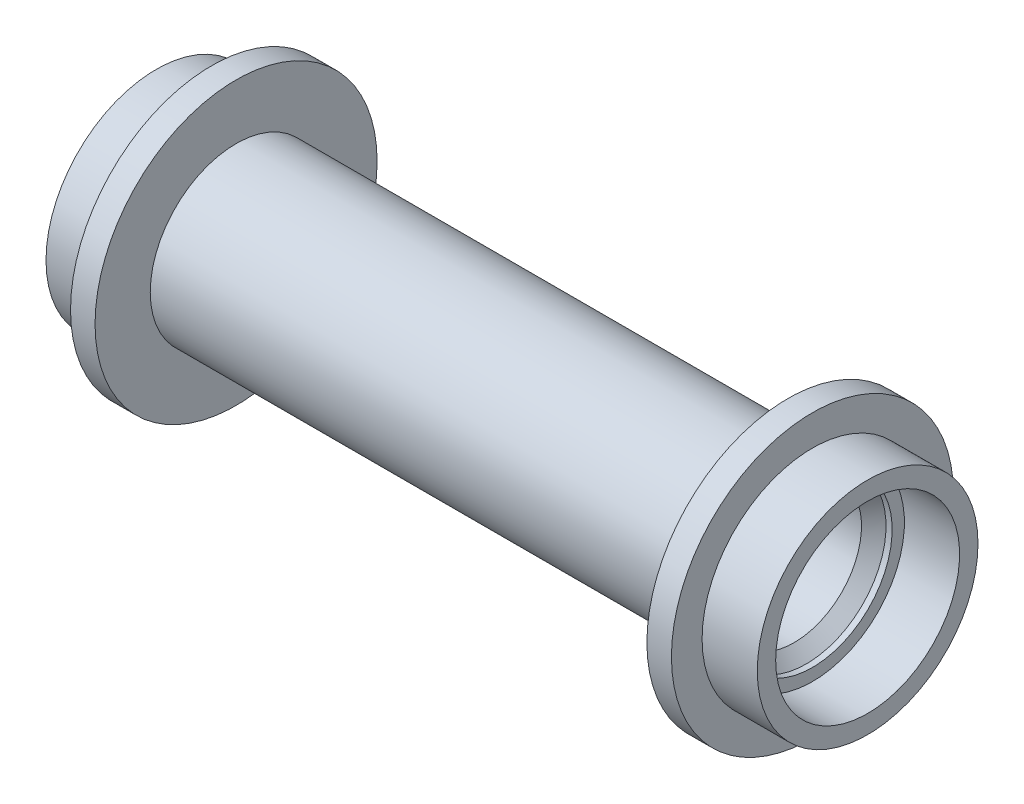
ISO-10303-21;
HEADER;
FILE_DESCRIPTION(('STEP AP214'),'2;1');
FILE_NAME('part.step','',(''),(''),'','','');
FILE_SCHEMA(('AUTOMOTIVE_DESIGN { 1 0 10303 214 1 1 1 1 }'));
ENDSEC;
DATA;
#1=APPLICATION_CONTEXT('core data for automotive mechanical design processes');
#2=APPLICATION_PROTOCOL_DEFINITION('international standard','automotive_design',2000,#1);
#3=PRODUCT_CONTEXT('',#1,'mechanical');
#4=PRODUCT('Part','Part','',(#3));
#5=PRODUCT_RELATED_PRODUCT_CATEGORY('part','',(#4));
#6=PRODUCT_DEFINITION_FORMATION('','',#4);
#7=PRODUCT_DEFINITION_CONTEXT('part definition',#1,'design');
#8=PRODUCT_DEFINITION('design','',#6,#7);
#9=PRODUCT_DEFINITION_SHAPE('','',#8);
#10=(LENGTH_UNIT() NAMED_UNIT(*) SI_UNIT(.MILLI.,.METRE.));
#11=(NAMED_UNIT(*) PLANE_ANGLE_UNIT() SI_UNIT($,.RADIAN.));
#12=(NAMED_UNIT(*) SI_UNIT($,.STERADIAN.) SOLID_ANGLE_UNIT());
#13=UNCERTAINTY_MEASURE_WITH_UNIT(LENGTH_MEASURE(1.E-05),#10,'distance_accuracy_value','');
#14=(GEOMETRIC_REPRESENTATION_CONTEXT(3) GLOBAL_UNCERTAINTY_ASSIGNED_CONTEXT((#13)) GLOBAL_UNIT_ASSIGNED_CONTEXT((#10,
#11,#12)) REPRESENTATION_CONTEXT('',''));
#15=CARTESIAN_POINT('',(0.,0.,0.));
#16=DIRECTION('',(0.,0.,1.));
#17=DIRECTION('',(1.,0.,0.));
#18=AXIS2_PLACEMENT_3D('',#15,#16,#17);
#19=CARTESIAN_POINT('',(0.,0.,0.));
#20=DIRECTION('',(-1.,0.,0.));
#21=DIRECTION('',(0.,0.,1.));
#22=AXIS2_PLACEMENT_3D('',#19,#20,#21);
#23=CYLINDRICAL_SURFACE('',#22,7.);
#24=CARTESIAN_POINT('',(22.5,0.,0.));
#25=DIRECTION('',(-1.,0.,0.));
#26=DIRECTION('',(0.,0.,1.));
#27=AXIS2_PLACEMENT_3D('',#24,#25,#26);
#28=CIRCLE('',#27,7.);
#29=CARTESIAN_POINT('',(22.5,0.,7.));
#30=VERTEX_POINT('',#29);
#31=EDGE_CURVE('E10',#30,#30,#28,.T.);
#32=ORIENTED_EDGE('',*,*,#31,.T.);
#33=EDGE_LOOP('',(#32));
#34=FACE_BOUND('',#33,.T.);
#35=CARTESIAN_POINT('',(-22.5,0.,0.));
#36=DIRECTION('',(-1.,0.,0.));
#37=DIRECTION('',(0.,0.,1.));
#38=AXIS2_PLACEMENT_3D('',#35,#36,#37);
#39=CIRCLE('',#38,7.);
#40=CARTESIAN_POINT('',(-22.5,0.,7.));
#41=VERTEX_POINT('',#40);
#42=EDGE_CURVE('E69',#41,#41,#39,.T.);
#43=ORIENTED_EDGE('',*,*,#42,.F.);
#44=EDGE_LOOP('',(#43));
#45=FACE_BOUND('',#44,.T.);
#46=ADVANCED_FACE('F32',(#34,#45),#23,.T.);
#47=CARTESIAN_POINT('',(22.5,0.,-7.));
#48=DIRECTION('',(1.,0.,0.));
#49=DIRECTION('',(0.,0.,-1.));
#50=AXIS2_PLACEMENT_3D('',#47,#48,#49);
#51=PLANE('',#50);
#52=ORIENTED_EDGE('',*,*,#31,.F.);
#53=EDGE_LOOP('',(#52));
#54=FACE_BOUND('',#53,.T.);
#55=CARTESIAN_POINT('',(22.5,0.,0.));
#56=DIRECTION('',(-1.,0.,0.));
#57=DIRECTION('',(0.,0.,1.));
#58=AXIS2_PLACEMENT_3D('',#55,#56,#57);
#59=CIRCLE('',#58,11.5);
#60=CARTESIAN_POINT('',(22.5,0.,11.5));
#61=VERTEX_POINT('',#60);
#62=EDGE_CURVE('E38',#61,#61,#59,.T.);
#63=ORIENTED_EDGE('',*,*,#62,.T.);
#64=EDGE_LOOP('',(#63));
#65=FACE_BOUND('',#64,.T.);
#66=ADVANCED_FACE('F114',(#54,#65),#51,.F.);
#67=CARTESIAN_POINT('',(0.,0.,0.));
#68=DIRECTION('',(-1.,0.,0.));
#69=DIRECTION('',(0.,0.,1.));
#70=AXIS2_PLACEMENT_3D('',#67,#68,#69);
#71=CYLINDRICAL_SURFACE('',#70,11.5);
#72=ORIENTED_EDGE('',*,*,#62,.F.);
#73=EDGE_LOOP('',(#72));
#74=FACE_BOUND('',#73,.T.);
#75=CARTESIAN_POINT('',(24.5,0.,0.));
#76=DIRECTION('',(-1.,0.,0.));
#77=DIRECTION('',(0.,0.,1.));
#78=AXIS2_PLACEMENT_3D('',#75,#76,#77);
#79=CIRCLE('',#78,11.5);
#80=CARTESIAN_POINT('',(24.5,0.,11.5));
#81=VERTEX_POINT('',#80);
#82=EDGE_CURVE('E42',#81,#81,#79,.T.);
#83=ORIENTED_EDGE('',*,*,#82,.T.);
#84=EDGE_LOOP('',(#83));
#85=FACE_BOUND('',#84,.T.);
#86=ADVANCED_FACE('F118',(#74,#85),#71,.T.);
#87=CARTESIAN_POINT('',(24.5,0.,-11.5));
#88=DIRECTION('',(-1.,0.,0.));
#89=DIRECTION('',(0.,0.,1.));
#90=AXIS2_PLACEMENT_3D('',#87,#88,#89);
#91=PLANE('',#90);
#92=ORIENTED_EDGE('',*,*,#82,.F.);
#93=EDGE_LOOP('',(#92));
#94=FACE_BOUND('',#93,.T.);
#95=CARTESIAN_POINT('',(24.5,0.,0.));
#96=DIRECTION('',(-1.,0.,0.));
#97=DIRECTION('',(0.,0.,1.));
#98=AXIS2_PLACEMENT_3D('',#95,#96,#97);
#99=CIRCLE('',#98,9.);
#100=CARTESIAN_POINT('',(24.5,0.,9.));
#101=VERTEX_POINT('',#100);
#102=EDGE_CURVE('E46',#101,#101,#99,.T.);
#103=ORIENTED_EDGE('',*,*,#102,.T.);
#104=EDGE_LOOP('',(#103));
#105=FACE_BOUND('',#104,.T.);
#106=ADVANCED_FACE('F194',(#94,#105),#91,.F.);
#107=CARTESIAN_POINT('',(0.,0.,0.));
#108=DIRECTION('',(-1.,0.,0.));
#109=DIRECTION('',(0.,0.,1.));
#110=AXIS2_PLACEMENT_3D('',#107,#108,#109);
#111=CYLINDRICAL_SURFACE('',#110,9.);
#112=ORIENTED_EDGE('',*,*,#102,.F.);
#113=EDGE_LOOP('',(#112));
#114=FACE_BOUND('',#113,.T.);
#115=CARTESIAN_POINT('',(29.,0.,0.));
#116=DIRECTION('',(-1.,0.,0.));
#117=DIRECTION('',(0.,0.,1.));
#118=AXIS2_PLACEMENT_3D('',#115,#116,#117);
#119=CIRCLE('',#118,9.);
#120=CARTESIAN_POINT('',(29.,0.,9.));
#121=VERTEX_POINT('',#120);
#122=EDGE_CURVE('E51',#121,#121,#119,.T.);
#123=ORIENTED_EDGE('',*,*,#122,.T.);
#124=EDGE_LOOP('',(#123));
#125=FACE_BOUND('',#124,.T.);
#126=ADVANCED_FACE('F190',(#114,#125),#111,.T.);
#127=CARTESIAN_POINT('',(29.,0.,-9.));
#128=DIRECTION('',(-1.,0.,0.));
#129=DIRECTION('',(0.,0.,1.));
#130=AXIS2_PLACEMENT_3D('',#127,#128,#129);
#131=PLANE('',#130);
#132=ORIENTED_EDGE('',*,*,#122,.F.);
#133=EDGE_LOOP('',(#132));
#134=FACE_BOUND('',#133,.T.);
#135=CARTESIAN_POINT('',(29.,0.,0.));
#136=DIRECTION('',(-1.,0.,0.));
#137=DIRECTION('',(0.,0.,1.));
#138=AXIS2_PLACEMENT_3D('',#135,#136,#137);
#139=CIRCLE('',#138,7.5);
#140=CARTESIAN_POINT('',(29.,0.,7.5));
#141=VERTEX_POINT('',#140);
#142=EDGE_CURVE('E54',#141,#141,#139,.T.);
#143=ORIENTED_EDGE('',*,*,#142,.T.);
#144=EDGE_LOOP('',(#143));
#145=FACE_BOUND('',#144,.T.);
#146=ADVANCED_FACE('F186',(#134,#145),#131,.F.);
#147=CARTESIAN_POINT('',(0.,0.,0.));
#148=DIRECTION('',(-1.,0.,0.));
#149=DIRECTION('',(0.,0.,1.));
#150=AXIS2_PLACEMENT_3D('',#147,#148,#149);
#151=CYLINDRICAL_SURFACE('',#150,7.5);
#152=ORIENTED_EDGE('',*,*,#142,.F.);
#153=EDGE_LOOP('',(#152));
#154=FACE_BOUND('',#153,.T.);
#155=CARTESIAN_POINT('',(24.5,0.,0.));
#156=DIRECTION('',(-1.,0.,0.));
#157=DIRECTION('',(0.,0.,1.));
#158=AXIS2_PLACEMENT_3D('',#155,#156,#157);
#159=CIRCLE('',#158,7.5);
#160=CARTESIAN_POINT('',(24.5,0.,7.5));
#161=VERTEX_POINT('',#160);
#162=EDGE_CURVE('E57',#161,#161,#159,.T.);
#163=ORIENTED_EDGE('',*,*,#162,.T.);
#164=EDGE_LOOP('',(#163));
#165=FACE_BOUND('',#164,.T.);
#166=ADVANCED_FACE('F182',(#154,#165),#151,.F.);
#167=CARTESIAN_POINT('',(24.5,0.,-7.5));
#168=DIRECTION('',(-1.,0.,0.));
#169=DIRECTION('',(0.,0.,1.));
#170=AXIS2_PLACEMENT_3D('',#167,#168,#169);
#171=PLANE('',#170);
#172=ORIENTED_EDGE('',*,*,#162,.F.);
#173=EDGE_LOOP('',(#172));
#174=FACE_BOUND('',#173,.T.);
#175=CARTESIAN_POINT('',(24.5,0.,0.));
#176=DIRECTION('',(-1.,0.,0.));
#177=DIRECTION('',(0.,0.,1.));
#178=AXIS2_PLACEMENT_3D('',#175,#176,#177);
#179=CIRCLE('',#178,6.5);
#180=CARTESIAN_POINT('',(24.5,0.,6.5));
#181=VERTEX_POINT('',#180);
#182=EDGE_CURVE('E60',#181,#181,#179,.T.);
#183=ORIENTED_EDGE('',*,*,#182,.T.);
#184=EDGE_LOOP('',(#183));
#185=FACE_BOUND('',#184,.T.);
#186=ADVANCED_FACE('F178',(#174,#185),#171,.F.);
#187=CARTESIAN_POINT('',(0.,0.,0.));
#188=DIRECTION('',(-1.,0.,0.));
#189=DIRECTION('',(0.,0.,1.));
#190=AXIS2_PLACEMENT_3D('',#187,#188,#189);
#191=CYLINDRICAL_SURFACE('',#190,6.5);
#192=ORIENTED_EDGE('',*,*,#182,.F.);
#193=EDGE_LOOP('',(#192));
#194=FACE_BOUND('',#193,.T.);
#195=CARTESIAN_POINT('',(24.,0.,0.));
#196=DIRECTION('',(-1.,0.,0.));
#197=DIRECTION('',(0.,0.,1.));
#198=AXIS2_PLACEMENT_3D('',#195,#196,#197);
#199=CIRCLE('',#198,6.5);
#200=CARTESIAN_POINT('',(24.,0.,6.5));
#201=VERTEX_POINT('',#200);
#202=EDGE_CURVE('E63',#201,#201,#199,.T.);
#203=ORIENTED_EDGE('',*,*,#202,.T.);
#204=EDGE_LOOP('',(#203));
#205=FACE_BOUND('',#204,.T.);
#206=ADVANCED_FACE('F174',(#194,#205),#191,.F.);
#207=CARTESIAN_POINT('',(23.,0.,0.));
#208=DIRECTION('',(1.,0.,0.));
#209=DIRECTION('',(0.,0.,-1.));
#210=AXIS2_PLACEMENT_3D('',#207,#208,#209);
#211=CONICAL_SURFACE('',#210,5.5,0.785398163397451);
#212=ORIENTED_EDGE('',*,*,#202,.F.);
#213=EDGE_LOOP('',(#212));
#214=FACE_BOUND('',#213,.T.);
#215=CARTESIAN_POINT('',(23.,0.,0.));
#216=DIRECTION('',(-1.,0.,0.));
#217=DIRECTION('',(0.,0.,1.));
#218=AXIS2_PLACEMENT_3D('',#215,#216,#217);
#219=CIRCLE('',#218,5.5);
#220=CARTESIAN_POINT('',(23.,0.,5.5));
#221=VERTEX_POINT('',#220);
#222=EDGE_CURVE('E66',#221,#221,#219,.T.);
#223=ORIENTED_EDGE('',*,*,#222,.T.);
#224=EDGE_LOOP('',(#223));
#225=FACE_BOUND('',#224,.T.);
#226=ADVANCED_FACE('F170',(#214,#225),#211,.F.);
#227=CARTESIAN_POINT('',(0.,0.,0.));
#228=DIRECTION('',(-1.,0.,0.));
#229=DIRECTION('',(0.,0.,1.));
#230=AXIS2_PLACEMENT_3D('',#227,#228,#229);
#231=CYLINDRICAL_SURFACE('',#230,5.49999999999999);
#232=ORIENTED_EDGE('',*,*,#222,.F.);
#233=EDGE_LOOP('',(#232));
#234=FACE_BOUND('',#233,.T.);
#235=CARTESIAN_POINT('',(-23.,0.,0.));
#236=DIRECTION('',(-1.,0.,0.));
#237=DIRECTION('',(0.,0.,1.));
#238=AXIS2_PLACEMENT_3D('',#235,#236,#237);
#239=CIRCLE('',#238,5.5);
#240=CARTESIAN_POINT('',(-23.,0.,5.5));
#241=VERTEX_POINT('',#240);
#242=EDGE_CURVE('E96',#241,#241,#239,.T.);
#243=ORIENTED_EDGE('',*,*,#242,.T.);
#244=EDGE_LOOP('',(#243));
#245=FACE_BOUND('',#244,.T.);
#246=ADVANCED_FACE('F100',(#234,#245),#231,.F.);
#247=CARTESIAN_POINT('',(-22.5,0.,-7.));
#248=DIRECTION('',(-1.,0.,0.));
#249=DIRECTION('',(0.,0.,-1.));
#250=AXIS2_PLACEMENT_3D('',#247,#248,#249);
#251=PLANE('',#250);
#252=ORIENTED_EDGE('',*,*,#42,.T.);
#253=EDGE_LOOP('',(#252));
#254=FACE_BOUND('',#253,.T.);
#255=CARTESIAN_POINT('',(-22.5,0.,0.));
#256=DIRECTION('',(-1.,0.,0.));
#257=DIRECTION('',(0.,0.,1.));
#258=AXIS2_PLACEMENT_3D('',#255,#256,#257);
#259=CIRCLE('',#258,11.5);
#260=CARTESIAN_POINT('',(-22.5,0.,11.5));
#261=VERTEX_POINT('',#260);
#262=EDGE_CURVE('E72',#261,#261,#259,.T.);
#263=ORIENTED_EDGE('',*,*,#262,.F.);
#264=EDGE_LOOP('',(#263));
#265=FACE_BOUND('',#264,.T.);
#266=ADVANCED_FACE('F123',(#254,#265),#251,.F.);
#267=CARTESIAN_POINT('',(0.,0.,0.));
#268=DIRECTION('',(1.,0.,0.));
#269=DIRECTION('',(0.,0.,1.));
#270=AXIS2_PLACEMENT_3D('',#267,#268,#269);
#271=CYLINDRICAL_SURFACE('',#270,11.5);
#272=ORIENTED_EDGE('',*,*,#262,.T.);
#273=EDGE_LOOP('',(#272));
#274=FACE_BOUND('',#273,.T.);
#275=CARTESIAN_POINT('',(-24.5,0.,0.));
#276=DIRECTION('',(-1.,0.,0.));
#277=DIRECTION('',(0.,0.,1.));
#278=AXIS2_PLACEMENT_3D('',#275,#276,#277);
#279=CIRCLE('',#278,11.5);
#280=CARTESIAN_POINT('',(-24.5,0.,11.5));
#281=VERTEX_POINT('',#280);
#282=EDGE_CURVE('E75',#281,#281,#279,.T.);
#283=ORIENTED_EDGE('',*,*,#282,.F.);
#284=EDGE_LOOP('',(#283));
#285=FACE_BOUND('',#284,.T.);
#286=ADVANCED_FACE('F126',(#274,#285),#271,.T.);
#287=CARTESIAN_POINT('',(-24.5,0.,-11.5));
#288=DIRECTION('',(1.,0.,0.));
#289=DIRECTION('',(0.,0.,1.));
#290=AXIS2_PLACEMENT_3D('',#287,#288,#289);
#291=PLANE('',#290);
#292=ORIENTED_EDGE('',*,*,#282,.T.);
#293=EDGE_LOOP('',(#292));
#294=FACE_BOUND('',#293,.T.);
#295=CARTESIAN_POINT('',(-24.5,0.,0.));
#296=DIRECTION('',(-1.,0.,0.));
#297=DIRECTION('',(0.,0.,1.));
#298=AXIS2_PLACEMENT_3D('',#295,#296,#297);
#299=CIRCLE('',#298,9.);
#300=CARTESIAN_POINT('',(-24.5,0.,9.));
#301=VERTEX_POINT('',#300);
#302=EDGE_CURVE('E78',#301,#301,#299,.T.);
#303=ORIENTED_EDGE('',*,*,#302,.F.);
#304=EDGE_LOOP('',(#303));
#305=FACE_BOUND('',#304,.T.);
#306=ADVANCED_FACE('F132',(#294,#305),#291,.F.);
#307=CARTESIAN_POINT('',(0.,0.,0.));
#308=DIRECTION('',(1.,0.,0.));
#309=DIRECTION('',(0.,0.,1.));
#310=AXIS2_PLACEMENT_3D('',#307,#308,#309);
#311=CYLINDRICAL_SURFACE('',#310,9.);
#312=ORIENTED_EDGE('',*,*,#302,.T.);
#313=EDGE_LOOP('',(#312));
#314=FACE_BOUND('',#313,.T.);
#315=CARTESIAN_POINT('',(-29.,0.,0.));
#316=DIRECTION('',(-1.,0.,0.));
#317=DIRECTION('',(0.,0.,1.));
#318=AXIS2_PLACEMENT_3D('',#315,#316,#317);
#319=CIRCLE('',#318,9.);
#320=CARTESIAN_POINT('',(-29.,0.,9.));
#321=VERTEX_POINT('',#320);
#322=EDGE_CURVE('E81',#321,#321,#319,.T.);
#323=ORIENTED_EDGE('',*,*,#322,.F.);
#324=EDGE_LOOP('',(#323));
#325=FACE_BOUND('',#324,.T.);
#326=ADVANCED_FACE('F138',(#314,#325),#311,.T.);
#327=CARTESIAN_POINT('',(-29.,0.,-9.));
#328=DIRECTION('',(1.,0.,0.));
#329=DIRECTION('',(0.,0.,1.));
#330=AXIS2_PLACEMENT_3D('',#327,#328,#329);
#331=PLANE('',#330);
#332=ORIENTED_EDGE('',*,*,#322,.T.);
#333=EDGE_LOOP('',(#332));
#334=FACE_BOUND('',#333,.T.);
#335=CARTESIAN_POINT('',(-29.,0.,0.));
#336=DIRECTION('',(-1.,0.,0.));
#337=DIRECTION('',(0.,0.,1.));
#338=AXIS2_PLACEMENT_3D('',#335,#336,#337);
#339=CIRCLE('',#338,7.5);
#340=CARTESIAN_POINT('',(-29.,0.,7.5));
#341=VERTEX_POINT('',#340);
#342=EDGE_CURVE('E84',#341,#341,#339,.T.);
#343=ORIENTED_EDGE('',*,*,#342,.F.);
#344=EDGE_LOOP('',(#343));
#345=FACE_BOUND('',#344,.T.);
#346=ADVANCED_FACE('F144',(#334,#345),#331,.F.);
#347=CARTESIAN_POINT('',(0.,0.,0.));
#348=DIRECTION('',(1.,0.,0.));
#349=DIRECTION('',(0.,0.,1.));
#350=AXIS2_PLACEMENT_3D('',#347,#348,#349);
#351=CYLINDRICAL_SURFACE('',#350,7.5);
#352=ORIENTED_EDGE('',*,*,#342,.T.);
#353=EDGE_LOOP('',(#352));
#354=FACE_BOUND('',#353,.T.);
#355=CARTESIAN_POINT('',(-24.5,0.,0.));
#356=DIRECTION('',(-1.,0.,0.));
#357=DIRECTION('',(0.,0.,1.));
#358=AXIS2_PLACEMENT_3D('',#355,#356,#357);
#359=CIRCLE('',#358,7.5);
#360=CARTESIAN_POINT('',(-24.5,0.,7.5));
#361=VERTEX_POINT('',#360);
#362=EDGE_CURVE('E87',#361,#361,#359,.T.);
#363=ORIENTED_EDGE('',*,*,#362,.F.);
#364=EDGE_LOOP('',(#363));
#365=FACE_BOUND('',#364,.T.);
#366=ADVANCED_FACE('F150',(#354,#365),#351,.F.);
#367=CARTESIAN_POINT('',(-24.5,0.,-7.5));
#368=DIRECTION('',(1.,0.,0.));
#369=DIRECTION('',(0.,0.,1.));
#370=AXIS2_PLACEMENT_3D('',#367,#368,#369);
#371=PLANE('',#370);
#372=ORIENTED_EDGE('',*,*,#362,.T.);
#373=EDGE_LOOP('',(#372));
#374=FACE_BOUND('',#373,.T.);
#375=CARTESIAN_POINT('',(-24.5,0.,0.));
#376=DIRECTION('',(-1.,0.,0.));
#377=DIRECTION('',(0.,0.,1.));
#378=AXIS2_PLACEMENT_3D('',#375,#376,#377);
#379=CIRCLE('',#378,6.5);
#380=CARTESIAN_POINT('',(-24.5,0.,6.5));
#381=VERTEX_POINT('',#380);
#382=EDGE_CURVE('E90',#381,#381,#379,.T.);
#383=ORIENTED_EDGE('',*,*,#382,.F.);
#384=EDGE_LOOP('',(#383));
#385=FACE_BOUND('',#384,.T.);
#386=ADVANCED_FACE('F110',(#374,#385),#371,.F.);
#387=CARTESIAN_POINT('',(0.,0.,0.));
#388=DIRECTION('',(1.,0.,0.));
#389=DIRECTION('',(0.,0.,1.));
#390=AXIS2_PLACEMENT_3D('',#387,#388,#389);
#391=CYLINDRICAL_SURFACE('',#390,6.5);
#392=ORIENTED_EDGE('',*,*,#382,.T.);
#393=EDGE_LOOP('',(#392));
#394=FACE_BOUND('',#393,.T.);
#395=CARTESIAN_POINT('',(-24.,0.,0.));
#396=DIRECTION('',(-1.,0.,0.));
#397=DIRECTION('',(0.,0.,1.));
#398=AXIS2_PLACEMENT_3D('',#395,#396,#397);
#399=CIRCLE('',#398,6.5);
#400=CARTESIAN_POINT('',(-24.,0.,6.5));
#401=VERTEX_POINT('',#400);
#402=EDGE_CURVE('E93',#401,#401,#399,.T.);
#403=ORIENTED_EDGE('',*,*,#402,.F.);
#404=EDGE_LOOP('',(#403));
#405=FACE_BOUND('',#404,.T.);
#406=ADVANCED_FACE('F104',(#394,#405),#391,.F.);
#407=CARTESIAN_POINT('',(-23.,0.,0.));
#408=DIRECTION('',(-1.,0.,0.));
#409=DIRECTION('',(0.,0.,-1.));
#410=AXIS2_PLACEMENT_3D('',#407,#408,#409);
#411=CONICAL_SURFACE('',#410,5.5,0.785398163397451);
#412=ORIENTED_EDGE('',*,*,#402,.T.);
#413=EDGE_LOOP('',(#412));
#414=FACE_BOUND('',#413,.T.);
#415=ORIENTED_EDGE('',*,*,#242,.F.);
#416=EDGE_LOOP('',(#415));
#417=FACE_BOUND('',#416,.T.);
#418=ADVANCED_FACE('F102',(#414,#417),#411,.F.);
#419=CLOSED_SHELL('',(#46,#66,#86,#106,#126,#146,#166,#186,#206,#226,#246,#266,#286,#306,#326,
#346,#366,#386,#406,#418));
#420=MANIFOLD_SOLID_BREP('B2',#419);
#421=ADVANCED_BREP_SHAPE_REPRESENTATION('',(#18,#420),#14);
#422=SHAPE_DEFINITION_REPRESENTATION(#9,#421);
ENDSEC;
END-ISO-10303-21;
